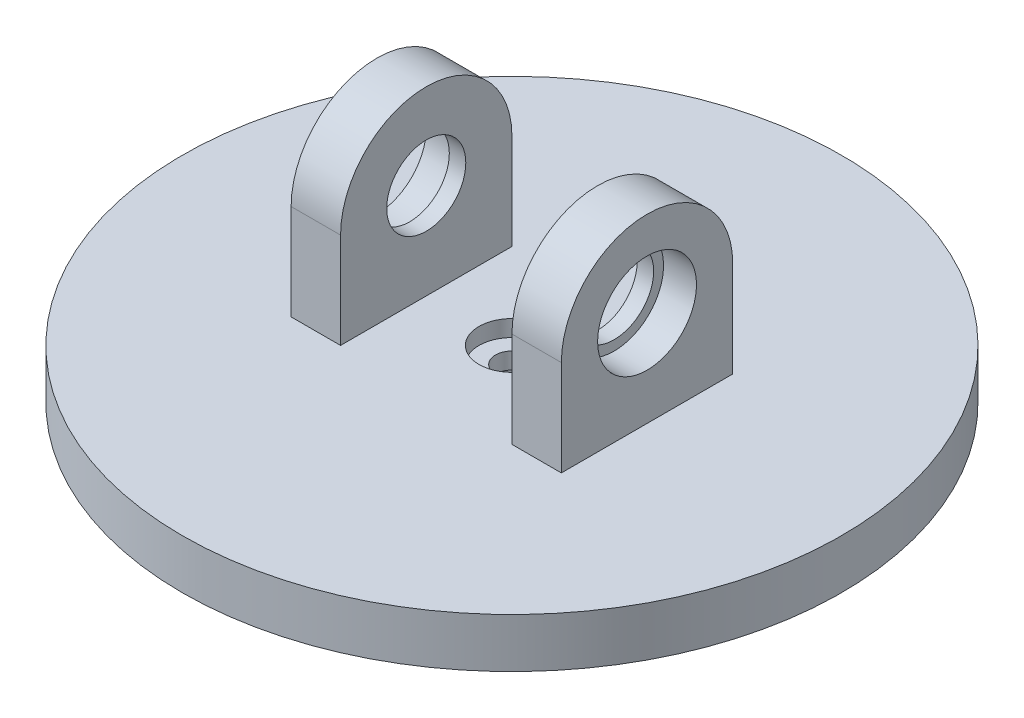
ISO-10303-21;
HEADER;
FILE_DESCRIPTION(('STEP AP214'),'2;1');
FILE_NAME('part.step','',(''),(''),'','','');
FILE_SCHEMA(('AUTOMOTIVE_DESIGN { 1 0 10303 214 1 1 1 1 }'));
ENDSEC;
DATA;
#1=APPLICATION_CONTEXT('core data for automotive mechanical design processes');
#2=APPLICATION_PROTOCOL_DEFINITION('international standard','automotive_design',2000,#1);
#3=PRODUCT_CONTEXT('',#1,'mechanical');
#4=PRODUCT('Part','Part','',(#3));
#5=PRODUCT_RELATED_PRODUCT_CATEGORY('part','',(#4));
#6=PRODUCT_DEFINITION_FORMATION('','',#4);
#7=PRODUCT_DEFINITION_CONTEXT('part definition',#1,'design');
#8=PRODUCT_DEFINITION('design','',#6,#7);
#9=PRODUCT_DEFINITION_SHAPE('','',#8);
#10=(LENGTH_UNIT() NAMED_UNIT(*) SI_UNIT(.MILLI.,.METRE.));
#11=(NAMED_UNIT(*) PLANE_ANGLE_UNIT() SI_UNIT($,.RADIAN.));
#12=(NAMED_UNIT(*) SI_UNIT($,.STERADIAN.) SOLID_ANGLE_UNIT());
#13=UNCERTAINTY_MEASURE_WITH_UNIT(LENGTH_MEASURE(1.E-05),#10,'distance_accuracy_value','');
#14=(GEOMETRIC_REPRESENTATION_CONTEXT(3) GLOBAL_UNCERTAINTY_ASSIGNED_CONTEXT((#13)) GLOBAL_UNIT_ASSIGNED_CONTEXT((#10,
#11,#12)) REPRESENTATION_CONTEXT('',''));
#15=CARTESIAN_POINT('',(0.,0.,0.));
#16=DIRECTION('',(0.,0.,1.));
#17=DIRECTION('',(1.,0.,0.));
#18=AXIS2_PLACEMENT_3D('',#15,#16,#17);
#19=CARTESIAN_POINT('',(-26.,70.,0.));
#20=DIRECTION('',(1.,0.,0.));
#21=DIRECTION('',(0.,0.,-1.));
#22=AXIS2_PLACEMENT_3D('',#19,#20,#21);
#23=PLANE('',#22);
#24=CARTESIAN_POINT('',(-26.,44.,0.));
#25=DIRECTION('',(1.,0.,0.));
#26=DIRECTION('',(0.,0.,-1.));
#27=AXIS2_PLACEMENT_3D('',#24,#25,#26);
#28=CIRCLE('',#27,12.);
#29=CARTESIAN_POINT('',(-26.,44.,-12.));
#30=VERTEX_POINT('',#29);
#31=EDGE_CURVE('E148',#30,#30,#28,.T.);
#32=ORIENTED_EDGE('',*,*,#31,.F.);
#33=EDGE_LOOP('',(#32));
#34=FACE_BOUND('',#33,.T.);
#35=CARTESIAN_POINT('',(-26.,44.,0.));
#36=DIRECTION('',(1.,0.,0.));
#37=DIRECTION('',(0.,0.,-1.));
#38=AXIS2_PLACEMENT_3D('',#35,#36,#37);
#39=CIRCLE('',#38,26.);
#40=CARTESIAN_POINT('',(-25.9999999999999,44.,-26.));
#41=VERTEX_POINT('',#40);
#42=CARTESIAN_POINT('',(-25.9999999999999,44.,26.));
#43=VERTEX_POINT('',#42);
#44=EDGE_CURVE('E202',#41,#43,#39,.T.);
#45=ORIENTED_EDGE('',*,*,#44,.T.);
#46=DIRECTION('',(0.,-1.,0.));
#47=VECTOR('',#46,1.);
#48=CARTESIAN_POINT('',(-26.,70.,26.));
#49=LINE('',#48,#47);
#50=CARTESIAN_POINT('',(-26.,15.,26.));
#51=VERTEX_POINT('',#50);
#52=EDGE_CURVE('E128',#43,#51,#49,.T.);
#53=ORIENTED_EDGE('',*,*,#52,.T.);
#54=DIRECTION('',(0.,0.,1.));
#55=VECTOR('',#54,1.);
#56=CARTESIAN_POINT('',(-26.,15.,0.));
#57=LINE('',#56,#55);
#58=CARTESIAN_POINT('',(-26.,15.,-26.));
#59=VERTEX_POINT('',#58);
#60=EDGE_CURVE('E220',#59,#51,#57,.T.);
#61=ORIENTED_EDGE('',*,*,#60,.F.);
#62=DIRECTION('',(0.,-1.,0.));
#63=VECTOR('',#62,1.);
#64=CARTESIAN_POINT('',(-26.,70.,-26.));
#65=LINE('',#64,#63);
#66=EDGE_CURVE('E137',#41,#59,#65,.T.);
#67=ORIENTED_EDGE('',*,*,#66,.F.);
#68=EDGE_LOOP('',(#45,#53,#61,#67));
#69=FACE_BOUND('',#68,.T.);
#70=ADVANCED_FACE('F41',(#34,#69),#23,.T.);
#71=CARTESIAN_POINT('',(-41.,70.,0.));
#72=DIRECTION('',(-1.,0.,0.));
#73=DIRECTION('',(0.,0.,1.));
#74=AXIS2_PLACEMENT_3D('',#71,#72,#73);
#75=PLANE('',#74);
#76=CARTESIAN_POINT('',(-41.,44.,0.));
#77=DIRECTION('',(-1.,0.,0.));
#78=DIRECTION('',(0.,0.,1.));
#79=AXIS2_PLACEMENT_3D('',#76,#77,#78);
#80=CIRCLE('',#79,15.);
#81=CARTESIAN_POINT('',(-41.,44.,15.));
#82=VERTEX_POINT('',#81);
#83=EDGE_CURVE('E188',#82,#82,#80,.T.);
#84=ORIENTED_EDGE('',*,*,#83,.F.);
#85=EDGE_LOOP('',(#84));
#86=FACE_BOUND('',#85,.T.);
#87=DIRECTION('',(0.,-1.,0.));
#88=VECTOR('',#87,1.);
#89=CARTESIAN_POINT('',(-41.,70.,26.));
#90=LINE('',#89,#88);
#91=CARTESIAN_POINT('',(-41.,44.,26.));
#92=VERTEX_POINT('',#91);
#93=CARTESIAN_POINT('',(-41.,15.,26.));
#94=VERTEX_POINT('',#93);
#95=EDGE_CURVE('E126',#92,#94,#90,.T.);
#96=ORIENTED_EDGE('',*,*,#95,.F.);
#97=CARTESIAN_POINT('',(-41.,44.,0.));
#98=DIRECTION('',(-1.,0.,0.));
#99=DIRECTION('',(0.,0.,1.));
#100=AXIS2_PLACEMENT_3D('',#97,#98,#99);
#101=CIRCLE('',#100,26.);
#102=CARTESIAN_POINT('',(-41.,44.,-26.));
#103=VERTEX_POINT('',#102);
#104=EDGE_CURVE('E111',#92,#103,#101,.T.);
#105=ORIENTED_EDGE('',*,*,#104,.T.);
#106=DIRECTION('',(0.,-1.,0.));
#107=VECTOR('',#106,1.);
#108=CARTESIAN_POINT('',(-41.,70.,-26.));
#109=LINE('',#108,#107);
#110=CARTESIAN_POINT('',(-41.,15.,-26.));
#111=VERTEX_POINT('',#110);
#112=EDGE_CURVE('E135',#103,#111,#109,.T.);
#113=ORIENTED_EDGE('',*,*,#112,.T.);
#114=DIRECTION('',(0.,0.,-1.));
#115=VECTOR('',#114,1.);
#116=CARTESIAN_POINT('',(-41.,15.,0.));
#117=LINE('',#116,#115);
#118=EDGE_CURVE('E133',#94,#111,#117,.T.);
#119=ORIENTED_EDGE('',*,*,#118,.F.);
#120=EDGE_LOOP('',(#96,#105,#113,#119));
#121=FACE_BOUND('',#120,.T.);
#122=ADVANCED_FACE('F131',(#86,#121),#75,.T.);
#123=CARTESIAN_POINT('',(26.,70.,0.));
#124=DIRECTION('',(-1.,0.,0.));
#125=DIRECTION('',(0.,0.,1.));
#126=AXIS2_PLACEMENT_3D('',#123,#124,#125);
#127=PLANE('',#126);
#128=CARTESIAN_POINT('',(26.,44.,0.));
#129=DIRECTION('',(1.,0.,0.));
#130=DIRECTION('',(0.,0.,-1.));
#131=AXIS2_PLACEMENT_3D('',#128,#129,#130);
#132=CIRCLE('',#131,12.);
#133=CARTESIAN_POINT('',(26.,44.,-12.));
#134=VERTEX_POINT('',#133);
#135=EDGE_CURVE('E303',#134,#134,#132,.T.);
#136=ORIENTED_EDGE('',*,*,#135,.T.);
#137=EDGE_LOOP('',(#136));
#138=FACE_BOUND('',#137,.T.);
#139=DIRECTION('',(0.,-1.,0.));
#140=VECTOR('',#139,1.);
#141=CARTESIAN_POINT('',(26.,70.,26.));
#142=LINE('',#141,#140);
#143=CARTESIAN_POINT('',(26.,44.,26.));
#144=VERTEX_POINT('',#143);
#145=CARTESIAN_POINT('',(26.,15.,26.));
#146=VERTEX_POINT('',#145);
#147=EDGE_CURVE('E58',#144,#146,#142,.T.);
#148=ORIENTED_EDGE('',*,*,#147,.F.);
#149=CARTESIAN_POINT('',(26.,44.,0.));
#150=DIRECTION('',(-1.,0.,0.));
#151=DIRECTION('',(0.,0.,1.));
#152=AXIS2_PLACEMENT_3D('',#149,#150,#151);
#153=CIRCLE('',#152,26.);
#154=CARTESIAN_POINT('',(26.,44.,-26.));
#155=VERTEX_POINT('',#154);
#156=EDGE_CURVE('E196',#144,#155,#153,.T.);
#157=ORIENTED_EDGE('',*,*,#156,.T.);
#158=DIRECTION('',(0.,-1.,0.));
#159=VECTOR('',#158,1.);
#160=CARTESIAN_POINT('',(26.,70.,-26.));
#161=LINE('',#160,#159);
#162=CARTESIAN_POINT('',(26.,15.,-26.));
#163=VERTEX_POINT('',#162);
#164=EDGE_CURVE('E214',#155,#163,#161,.T.);
#165=ORIENTED_EDGE('',*,*,#164,.T.);
#166=DIRECTION('',(0.,0.,-1.));
#167=VECTOR('',#166,1.);
#168=CARTESIAN_POINT('',(26.,15.,0.));
#169=LINE('',#168,#167);
#170=EDGE_CURVE('E204',#146,#163,#169,.T.);
#171=ORIENTED_EDGE('',*,*,#170,.F.);
#172=EDGE_LOOP('',(#148,#157,#165,#171));
#173=FACE_BOUND('',#172,.T.);
#174=ADVANCED_FACE('F256',(#138,#173),#127,.T.);
#175=CARTESIAN_POINT('',(41.,70.,0.));
#176=DIRECTION('',(-1.,0.,0.));
#177=DIRECTION('',(0.,0.,1.));
#178=AXIS2_PLACEMENT_3D('',#175,#176,#177);
#179=PLANE('',#178);
#180=CARTESIAN_POINT('',(41.,44.,0.));
#181=DIRECTION('',(-1.,0.,0.));
#182=DIRECTION('',(0.,0.,1.));
#183=AXIS2_PLACEMENT_3D('',#180,#181,#182);
#184=CIRCLE('',#183,15.);
#185=CARTESIAN_POINT('',(41.,44.,15.));
#186=VERTEX_POINT('',#185);
#187=EDGE_CURVE('E160',#186,#186,#184,.T.);
#188=ORIENTED_EDGE('',*,*,#187,.T.);
#189=EDGE_LOOP('',(#188));
#190=FACE_BOUND('',#189,.T.);
#191=CARTESIAN_POINT('',(41.,44.,0.));
#192=DIRECTION('',(-1.,0.,0.));
#193=DIRECTION('',(0.,0.,1.));
#194=AXIS2_PLACEMENT_3D('',#191,#192,#193);
#195=CIRCLE('',#194,26.);
#196=CARTESIAN_POINT('',(41.,44.,-26.));
#197=VERTEX_POINT('',#196);
#198=CARTESIAN_POINT('',(41.,44.,26.));
#199=VERTEX_POINT('',#198);
#200=EDGE_CURVE('E195',#197,#199,#195,.F.);
#201=ORIENTED_EDGE('',*,*,#200,.T.);
#202=DIRECTION('',(0.,-1.,0.));
#203=VECTOR('',#202,1.);
#204=CARTESIAN_POINT('',(41.,70.,26.));
#205=LINE('',#204,#203);
#206=CARTESIAN_POINT('',(41.,15.,26.));
#207=VERTEX_POINT('',#206);
#208=EDGE_CURVE('E66',#199,#207,#205,.T.);
#209=ORIENTED_EDGE('',*,*,#208,.T.);
#210=DIRECTION('',(0.,0.,-1.));
#211=VECTOR('',#210,1.);
#212=CARTESIAN_POINT('',(41.,15.,0.));
#213=LINE('',#212,#211);
#214=CARTESIAN_POINT('',(41.,15.,-26.));
#215=VERTEX_POINT('',#214);
#216=EDGE_CURVE('E209',#207,#215,#213,.T.);
#217=ORIENTED_EDGE('',*,*,#216,.T.);
#218=DIRECTION('',(0.,-1.,0.));
#219=VECTOR('',#218,1.);
#220=CARTESIAN_POINT('',(41.,70.,-26.));
#221=LINE('',#220,#219);
#222=EDGE_CURVE('E216',#197,#215,#221,.T.);
#223=ORIENTED_EDGE('',*,*,#222,.F.);
#224=EDGE_LOOP('',(#201,#209,#217,#223));
#225=FACE_BOUND('',#224,.T.);
#226=ADVANCED_FACE('F265',(#190,#225),#179,.F.);
#227=CARTESIAN_POINT('',(0.,15.,0.));
#228=DIRECTION('',(0.,-1.,0.));
#229=DIRECTION('',(0.,0.,-1.));
#230=AXIS2_PLACEMENT_3D('',#227,#228,#229);
#231=CYLINDRICAL_SURFACE('',#230,100.);
#232=CARTESIAN_POINT('',(0.,15.,0.));
#233=DIRECTION('',(0.,1.,0.));
#234=DIRECTION('',(0.,0.,1.));
#235=AXIS2_PLACEMENT_3D('',#232,#233,#234);
#236=CIRCLE('',#235,100.);
#237=CARTESIAN_POINT('',(0.,15.,100.));
#238=VERTEX_POINT('',#237);
#239=EDGE_CURVE('E11',#238,#238,#236,.T.);
#240=ORIENTED_EDGE('',*,*,#239,.F.);
#241=EDGE_LOOP('',(#240));
#242=FACE_BOUND('',#241,.T.);
#243=CARTESIAN_POINT('',(0.,0.,0.));
#244=DIRECTION('',(0.,1.,0.));
#245=DIRECTION('',(0.,0.,1.));
#246=AXIS2_PLACEMENT_3D('',#243,#244,#245);
#247=CIRCLE('',#246,100.);
#248=CARTESIAN_POINT('',(0.,0.,100.));
#249=VERTEX_POINT('',#248);
#250=EDGE_CURVE('E50',#249,#249,#247,.T.);
#251=ORIENTED_EDGE('',*,*,#250,.T.);
#252=EDGE_LOOP('',(#251));
#253=FACE_BOUND('',#252,.T.);
#254=ADVANCED_FACE('F43',(#242,#253),#231,.T.);
#255=CARTESIAN_POINT('',(0.,15.,0.));
#256=DIRECTION('',(0.,1.,0.));
#257=DIRECTION('',(0.,0.,1.));
#258=AXIS2_PLACEMENT_3D('',#255,#256,#257);
#259=PLANE('',#258);
#260=CARTESIAN_POINT('',(0.,15.,0.));
#261=DIRECTION('',(0.,1.,0.));
#262=DIRECTION('',(0.,0.,1.));
#263=AXIS2_PLACEMENT_3D('',#260,#261,#262);
#264=CIRCLE('',#263,10.);
#265=CARTESIAN_POINT('',(0.,15.,10.));
#266=VERTEX_POINT('',#265);
#267=EDGE_CURVE('E182',#266,#266,#264,.T.);
#268=ORIENTED_EDGE('',*,*,#267,.F.);
#269=EDGE_LOOP('',(#268));
#270=FACE_BOUND('',#269,.T.);
#271=ORIENTED_EDGE('',*,*,#170,.T.);
#272=DIRECTION('',(1.,0.,0.));
#273=VECTOR('',#272,1.);
#274=CARTESIAN_POINT('',(0.,15.,-26.));
#275=LINE('',#274,#273);
#276=EDGE_CURVE('E211',#163,#215,#275,.T.);
#277=ORIENTED_EDGE('',*,*,#276,.T.);
#278=ORIENTED_EDGE('',*,*,#216,.F.);
#279=DIRECTION('',(1.,0.,0.));
#280=VECTOR('',#279,1.);
#281=CARTESIAN_POINT('',(0.,15.,26.));
#282=LINE('',#281,#280);
#283=EDGE_CURVE('E207',#146,#207,#282,.T.);
#284=ORIENTED_EDGE('',*,*,#283,.F.);
#285=EDGE_LOOP('',(#271,#277,#278,#284));
#286=FACE_BOUND('',#285,.T.);
#287=ORIENTED_EDGE('',*,*,#60,.T.);
#288=DIRECTION('',(1.,0.,0.));
#289=VECTOR('',#288,1.);
#290=CARTESIAN_POINT('',(0.,15.,26.));
#291=LINE('',#290,#289);
#292=EDGE_CURVE('E139',#94,#51,#291,.T.);
#293=ORIENTED_EDGE('',*,*,#292,.F.);
#294=ORIENTED_EDGE('',*,*,#118,.T.);
#295=DIRECTION('',(1.,0.,0.));
#296=VECTOR('',#295,1.);
#297=CARTESIAN_POINT('',(0.,15.,-26.));
#298=LINE('',#297,#296);
#299=EDGE_CURVE('E223',#111,#59,#298,.T.);
#300=ORIENTED_EDGE('',*,*,#299,.T.);
#301=EDGE_LOOP('',(#287,#293,#294,#300));
#302=FACE_BOUND('',#301,.T.);
#303=ORIENTED_EDGE('',*,*,#239,.T.);
#304=EDGE_LOOP('',(#303));
#305=FACE_BOUND('',#304,.T.);
#306=ADVANCED_FACE('F228',(#270,#286,#302,#305),#259,.T.);
#307=CARTESIAN_POINT('',(0.,0.,0.));
#308=DIRECTION('',(0.,1.,0.));
#309=DIRECTION('',(0.,0.,1.));
#310=AXIS2_PLACEMENT_3D('',#307,#308,#309);
#311=PLANE('',#310);
#312=CARTESIAN_POINT('',(0.,0.,0.));
#313=DIRECTION('',(0.,-1.,0.));
#314=DIRECTION('',(0.,0.,-1.));
#315=AXIS2_PLACEMENT_3D('',#312,#313,#314);
#316=CIRCLE('',#315,90.);
#317=CARTESIAN_POINT('',(0.,0.,-90.));
#318=VERTEX_POINT('',#317);
#319=EDGE_CURVE('E170',#318,#318,#316,.T.);
#320=ORIENTED_EDGE('',*,*,#319,.F.);
#321=EDGE_LOOP('',(#320));
#322=FACE_BOUND('',#321,.T.);
#323=ORIENTED_EDGE('',*,*,#250,.F.);
#324=EDGE_LOOP('',(#323));
#325=FACE_BOUND('',#324,.T.);
#326=ADVANCED_FACE('F236',(#322,#325),#311,.F.);
#327=CARTESIAN_POINT('',(0.,70.,-26.));
#328=DIRECTION('',(0.,0.,-1.));
#329=DIRECTION('',(-1.,0.,0.));
#330=AXIS2_PLACEMENT_3D('',#327,#328,#329);
#331=PLANE('',#330);
#332=DIRECTION('',(-1.,0.,0.));
#333=VECTOR('',#332,1.);
#334=CARTESIAN_POINT('',(77.7695526217005,44.,-26.));
#335=LINE('',#334,#333);
#336=EDGE_CURVE('E117',#41,#103,#335,.T.);
#337=ORIENTED_EDGE('',*,*,#336,.F.);
#338=ORIENTED_EDGE('',*,*,#66,.T.);
#339=ORIENTED_EDGE('',*,*,#299,.F.);
#340=ORIENTED_EDGE('',*,*,#112,.F.);
#341=EDGE_LOOP('',(#337,#338,#339,#340));
#342=FACE_BOUND('',#341,.T.);
#343=ADVANCED_FACE('F234',(#342),#331,.T.);
#344=CARTESIAN_POINT('',(0.,70.,26.));
#345=DIRECTION('',(0.,0.,-1.));
#346=DIRECTION('',(-1.,0.,0.));
#347=AXIS2_PLACEMENT_3D('',#344,#345,#346);
#348=PLANE('',#347);
#349=ORIENTED_EDGE('',*,*,#52,.F.);
#350=DIRECTION('',(-1.,0.,0.));
#351=VECTOR('',#350,1.);
#352=CARTESIAN_POINT('',(77.7695526217005,44.,26.));
#353=LINE('',#352,#351);
#354=EDGE_CURVE('E114',#43,#92,#353,.T.);
#355=ORIENTED_EDGE('',*,*,#354,.T.);
#356=ORIENTED_EDGE('',*,*,#95,.T.);
#357=ORIENTED_EDGE('',*,*,#292,.T.);
#358=EDGE_LOOP('',(#349,#355,#356,#357));
#359=FACE_BOUND('',#358,.T.);
#360=ADVANCED_FACE('F124',(#359),#348,.F.);
#361=CARTESIAN_POINT('',(0.,70.,26.));
#362=DIRECTION('',(0.,0.,-1.));
#363=DIRECTION('',(-1.,0.,0.));
#364=AXIS2_PLACEMENT_3D('',#361,#362,#363);
#365=PLANE('',#364);
#366=ORIENTED_EDGE('',*,*,#208,.F.);
#367=EDGE_CURVE('E121',#199,#144,#353,.T.);
#368=ORIENTED_EDGE('',*,*,#367,.T.);
#369=ORIENTED_EDGE('',*,*,#147,.T.);
#370=ORIENTED_EDGE('',*,*,#283,.T.);
#371=EDGE_LOOP('',(#366,#368,#369,#370));
#372=FACE_BOUND('',#371,.T.);
#373=ADVANCED_FACE('F242',(#372),#365,.F.);
#374=CARTESIAN_POINT('',(0.,70.,-26.));
#375=DIRECTION('',(0.,0.,-1.));
#376=DIRECTION('',(-1.,0.,0.));
#377=AXIS2_PLACEMENT_3D('',#374,#375,#376);
#378=PLANE('',#377);
#379=EDGE_CURVE('E197',#197,#155,#335,.T.);
#380=ORIENTED_EDGE('',*,*,#379,.F.);
#381=ORIENTED_EDGE('',*,*,#222,.T.);
#382=ORIENTED_EDGE('',*,*,#276,.F.);
#383=ORIENTED_EDGE('',*,*,#164,.F.);
#384=EDGE_LOOP('',(#380,#381,#382,#383));
#385=FACE_BOUND('',#384,.T.);
#386=ADVANCED_FACE('F275',(#385),#378,.T.);
#387=CARTESIAN_POINT('',(77.7695526217005,44.,0.));
#388=DIRECTION('',(-1.,0.,0.));
#389=DIRECTION('',(0.,0.,1.));
#390=AXIS2_PLACEMENT_3D('',#387,#388,#389);
#391=CYLINDRICAL_SURFACE('',#390,26.);
#392=ORIENTED_EDGE('',*,*,#156,.F.);
#393=ORIENTED_EDGE('',*,*,#367,.F.);
#394=ORIENTED_EDGE('',*,*,#200,.F.);
#395=ORIENTED_EDGE('',*,*,#379,.T.);
#396=EDGE_LOOP('',(#392,#393,#394,#395));
#397=FACE_BOUND('',#396,.T.);
#398=ADVANCED_FACE('F279',(#397),#391,.T.);
#399=ORIENTED_EDGE('',*,*,#336,.T.);
#400=ORIENTED_EDGE('',*,*,#104,.F.);
#401=ORIENTED_EDGE('',*,*,#354,.F.);
#402=ORIENTED_EDGE('',*,*,#44,.F.);
#403=EDGE_LOOP('',(#399,#400,#401,#402));
#404=FACE_BOUND('',#403,.T.);
#405=ADVANCED_FACE('F113',(#404),#391,.T.);
#406=CARTESIAN_POINT('',(-31.,44.,0.));
#407=DIRECTION('',(-1.,0.,0.));
#408=DIRECTION('',(0.,0.,1.));
#409=AXIS2_PLACEMENT_3D('',#406,#407,#408);
#410=CYLINDRICAL_SURFACE('',#409,15.);
#411=CARTESIAN_POINT('',(-31.,44.,0.));
#412=DIRECTION('',(-1.,0.,0.));
#413=DIRECTION('',(0.,0.,1.));
#414=AXIS2_PLACEMENT_3D('',#411,#412,#413);
#415=CIRCLE('',#414,15.);
#416=CARTESIAN_POINT('',(-31.,44.,15.));
#417=VERTEX_POINT('',#416);
#418=EDGE_CURVE('E129',#417,#417,#415,.T.);
#419=ORIENTED_EDGE('',*,*,#418,.F.);
#420=EDGE_LOOP('',(#419));
#421=FACE_BOUND('',#420,.T.);
#422=ORIENTED_EDGE('',*,*,#83,.T.);
#423=EDGE_LOOP('',(#422));
#424=FACE_BOUND('',#423,.T.);
#425=ADVANCED_FACE('F286',(#421,#424),#410,.F.);
#426=CARTESIAN_POINT('',(-31.,44.,0.));
#427=DIRECTION('',(-1.,0.,0.));
#428=DIRECTION('',(0.,0.,1.));
#429=AXIS2_PLACEMENT_3D('',#426,#427,#428);
#430=PLANE('',#429);
#431=CARTESIAN_POINT('',(-31.,44.,0.));
#432=DIRECTION('',(-1.,0.,0.));
#433=DIRECTION('',(0.,0.,1.));
#434=AXIS2_PLACEMENT_3D('',#431,#432,#433);
#435=CIRCLE('',#434,12.);
#436=CARTESIAN_POINT('',(-31.,44.,12.));
#437=VERTEX_POINT('',#436);
#438=EDGE_CURVE('E145',#437,#437,#435,.T.);
#439=ORIENTED_EDGE('',*,*,#438,.F.);
#440=EDGE_LOOP('',(#439));
#441=FACE_BOUND('',#440,.T.);
#442=ORIENTED_EDGE('',*,*,#418,.T.);
#443=EDGE_LOOP('',(#442));
#444=FACE_BOUND('',#443,.T.);
#445=ADVANCED_FACE('F354',(#441,#444),#430,.T.);
#446=CARTESIAN_POINT('',(0.,10.,0.));
#447=DIRECTION('',(0.,1.,0.));
#448=DIRECTION('',(0.,0.,1.));
#449=AXIS2_PLACEMENT_3D('',#446,#447,#448);
#450=CYLINDRICAL_SURFACE('',#449,10.);
#451=CARTESIAN_POINT('',(0.,10.,0.));
#452=DIRECTION('',(0.,1.,0.));
#453=DIRECTION('',(0.,0.,1.));
#454=AXIS2_PLACEMENT_3D('',#451,#452,#453);
#455=CIRCLE('',#454,10.);
#456=CARTESIAN_POINT('',(0.,10.,10.));
#457=VERTEX_POINT('',#456);
#458=EDGE_CURVE('E185',#457,#457,#455,.T.);
#459=ORIENTED_EDGE('',*,*,#458,.F.);
#460=EDGE_LOOP('',(#459));
#461=FACE_BOUND('',#460,.T.);
#462=ORIENTED_EDGE('',*,*,#267,.T.);
#463=EDGE_LOOP('',(#462));
#464=FACE_BOUND('',#463,.T.);
#465=ADVANCED_FACE('F352',(#461,#464),#450,.F.);
#466=CARTESIAN_POINT('',(0.,10.,0.));
#467=DIRECTION('',(0.,1.,0.));
#468=DIRECTION('',(0.,0.,1.));
#469=AXIS2_PLACEMENT_3D('',#466,#467,#468);
#470=PLANE('',#469);
#471=CARTESIAN_POINT('',(0.,10.,0.));
#472=DIRECTION('',(0.,-1.,0.));
#473=DIRECTION('',(0.,0.,-1.));
#474=AXIS2_PLACEMENT_3D('',#471,#472,#473);
#475=CIRCLE('',#474,5.);
#476=CARTESIAN_POINT('',(0.,10.,-5.));
#477=VERTEX_POINT('',#476);
#478=EDGE_CURVE('E152',#477,#477,#475,.T.);
#479=ORIENTED_EDGE('',*,*,#478,.T.);
#480=EDGE_LOOP('',(#479));
#481=FACE_BOUND('',#480,.T.);
#482=ORIENTED_EDGE('',*,*,#458,.T.);
#483=EDGE_LOOP('',(#482));
#484=FACE_BOUND('',#483,.T.);
#485=ADVANCED_FACE('F341',(#481,#484),#470,.T.);
#486=CARTESIAN_POINT('',(0.,2.8,0.));
#487=DIRECTION('',(0.,-1.,0.));
#488=DIRECTION('',(0.,0.,-1.));
#489=AXIS2_PLACEMENT_3D('',#486,#487,#488);
#490=CYLINDRICAL_SURFACE('',#489,90.);
#491=CARTESIAN_POINT('',(0.,2.8,0.));
#492=DIRECTION('',(0.,-1.,0.));
#493=DIRECTION('',(0.,0.,-1.));
#494=AXIS2_PLACEMENT_3D('',#491,#492,#493);
#495=CIRCLE('',#494,90.);
#496=CARTESIAN_POINT('',(0.,2.8,-90.));
#497=VERTEX_POINT('',#496);
#498=EDGE_CURVE('E173',#497,#497,#495,.T.);
#499=ORIENTED_EDGE('',*,*,#498,.F.);
#500=EDGE_LOOP('',(#499));
#501=FACE_BOUND('',#500,.T.);
#502=ORIENTED_EDGE('',*,*,#319,.T.);
#503=EDGE_LOOP('',(#502));
#504=FACE_BOUND('',#503,.T.);
#505=ADVANCED_FACE('F337',(#501,#504),#490,.F.);
#506=CARTESIAN_POINT('',(0.,2.8,0.));
#507=DIRECTION('',(0.,-1.,0.));
#508=DIRECTION('',(0.,0.,-1.));
#509=AXIS2_PLACEMENT_3D('',#506,#507,#508);
#510=PLANE('',#509);
#511=CARTESIAN_POINT('',(0.,2.8,0.));
#512=DIRECTION('',(0.,-1.,0.));
#513=DIRECTION('',(0.,0.,-1.));
#514=AXIS2_PLACEMENT_3D('',#511,#512,#513);
#515=CIRCLE('',#514,84.);
#516=CARTESIAN_POINT('',(0.,2.8,-84.));
#517=VERTEX_POINT('',#516);
#518=EDGE_CURVE('E167',#517,#517,#515,.T.);
#519=ORIENTED_EDGE('',*,*,#518,.F.);
#520=EDGE_LOOP('',(#519));
#521=FACE_BOUND('',#520,.T.);
#522=ORIENTED_EDGE('',*,*,#498,.T.);
#523=EDGE_LOOP('',(#522));
#524=FACE_BOUND('',#523,.T.);
#525=ADVANCED_FACE('F333',(#521,#524),#510,.T.);
#526=CARTESIAN_POINT('',(0.,2.8,0.));
#527=DIRECTION('',(0.,-1.,0.));
#528=DIRECTION('',(0.,0.,-1.));
#529=AXIS2_PLACEMENT_3D('',#526,#527,#528);
#530=CYLINDRICAL_SURFACE('',#529,84.);
#531=ORIENTED_EDGE('',*,*,#518,.T.);
#532=EDGE_LOOP('',(#531));
#533=FACE_BOUND('',#532,.T.);
#534=CARTESIAN_POINT('',(0.,0.,0.));
#535=DIRECTION('',(0.,-1.,0.));
#536=DIRECTION('',(0.,0.,-1.));
#537=AXIS2_PLACEMENT_3D('',#534,#535,#536);
#538=CIRCLE('',#537,84.);
#539=CARTESIAN_POINT('',(0.,0.,-84.));
#540=VERTEX_POINT('',#539);
#541=EDGE_CURVE('E165',#540,#540,#538,.T.);
#542=ORIENTED_EDGE('',*,*,#541,.F.);
#543=EDGE_LOOP('',(#542));
#544=FACE_BOUND('',#543,.T.);
#545=ADVANCED_FACE('F329',(#533,#544),#530,.T.);
#546=CARTESIAN_POINT('',(0.,5.,0.));
#547=DIRECTION('',(0.,-1.,0.));
#548=DIRECTION('',(0.,0.,-1.));
#549=AXIS2_PLACEMENT_3D('',#546,#547,#548);
#550=PLANE('',#549);
#551=CARTESIAN_POINT('',(0.,5.,0.));
#552=DIRECTION('',(0.,-1.,0.));
#553=DIRECTION('',(0.,0.,-1.));
#554=AXIS2_PLACEMENT_3D('',#551,#552,#553);
#555=CIRCLE('',#554,5.);
#556=CARTESIAN_POINT('',(0.,5.,-5.));
#557=VERTEX_POINT('',#556);
#558=EDGE_CURVE('E147',#557,#557,#555,.T.);
#559=ORIENTED_EDGE('',*,*,#558,.F.);
#560=EDGE_LOOP('',(#559));
#561=FACE_BOUND('',#560,.T.);
#562=CARTESIAN_POINT('',(0.,5.,0.));
#563=DIRECTION('',(0.,-1.,0.));
#564=DIRECTION('',(0.,0.,-1.));
#565=AXIS2_PLACEMENT_3D('',#562,#563,#564);
#566=CIRCLE('',#565,10.);
#567=CARTESIAN_POINT('',(0.,5.,-10.));
#568=VERTEX_POINT('',#567);
#569=EDGE_CURVE('E179',#568,#568,#566,.T.);
#570=ORIENTED_EDGE('',*,*,#569,.T.);
#571=EDGE_LOOP('',(#570));
#572=FACE_BOUND('',#571,.T.);
#573=ADVANCED_FACE('F332',(#561,#572),#550,.T.);
#574=CARTESIAN_POINT('',(0.,5.,0.));
#575=DIRECTION('',(0.,-1.,0.));
#576=DIRECTION('',(0.,0.,-1.));
#577=AXIS2_PLACEMENT_3D('',#574,#575,#576);
#578=CYLINDRICAL_SURFACE('',#577,10.);
#579=ORIENTED_EDGE('',*,*,#569,.F.);
#580=EDGE_LOOP('',(#579));
#581=FACE_BOUND('',#580,.T.);
#582=CARTESIAN_POINT('',(0.,0.,0.));
#583=DIRECTION('',(0.,-1.,0.));
#584=DIRECTION('',(0.,0.,-1.));
#585=AXIS2_PLACEMENT_3D('',#582,#583,#584);
#586=CIRCLE('',#585,10.);
#587=CARTESIAN_POINT('',(0.,0.,-10.));
#588=VERTEX_POINT('',#587);
#589=EDGE_CURVE('E176',#588,#588,#586,.T.);
#590=ORIENTED_EDGE('',*,*,#589,.T.);
#591=EDGE_LOOP('',(#590));
#592=FACE_BOUND('',#591,.T.);
#593=ADVANCED_FACE('F345',(#581,#592),#578,.F.);
#594=ORIENTED_EDGE('',*,*,#589,.F.);
#595=EDGE_LOOP('',(#594));
#596=FACE_BOUND('',#595,.T.);
#597=ORIENTED_EDGE('',*,*,#541,.T.);
#598=EDGE_LOOP('',(#597));
#599=FACE_BOUND('',#598,.T.);
#600=ADVANCED_FACE('F246',(#596,#599),#311,.F.);
#601=CARTESIAN_POINT('',(0.,10.,0.));
#602=DIRECTION('',(0.,-1.,0.));
#603=DIRECTION('',(0.,0.,-1.));
#604=AXIS2_PLACEMENT_3D('',#601,#602,#603);
#605=CYLINDRICAL_SURFACE('',#604,5.);
#606=ORIENTED_EDGE('',*,*,#478,.F.);
#607=EDGE_LOOP('',(#606));
#608=FACE_BOUND('',#607,.T.);
#609=ORIENTED_EDGE('',*,*,#558,.T.);
#610=EDGE_LOOP('',(#609));
#611=FACE_BOUND('',#610,.T.);
#612=ADVANCED_FACE('F323',(#608,#611),#605,.F.);
#613=CARTESIAN_POINT('',(-36.,44.,0.));
#614=DIRECTION('',(1.,0.,0.));
#615=DIRECTION('',(0.,0.,-1.));
#616=AXIS2_PLACEMENT_3D('',#613,#614,#615);
#617=CYLINDRICAL_SURFACE('',#616,12.);
#618=ORIENTED_EDGE('',*,*,#438,.T.);
#619=EDGE_LOOP('',(#618));
#620=FACE_BOUND('',#619,.T.);
#621=ORIENTED_EDGE('',*,*,#31,.T.);
#622=EDGE_LOOP('',(#621));
#623=FACE_BOUND('',#622,.T.);
#624=ADVANCED_FACE('F315',(#620,#623),#617,.F.);
#625=CARTESIAN_POINT('',(31.,44.,0.));
#626=DIRECTION('',(1.,0.,0.));
#627=DIRECTION('',(0.,0.,-1.));
#628=AXIS2_PLACEMENT_3D('',#625,#626,#627);
#629=CYLINDRICAL_SURFACE('',#628,15.);
#630=CARTESIAN_POINT('',(31.,44.,0.));
#631=DIRECTION('',(-1.,0.,0.));
#632=DIRECTION('',(0.,0.,1.));
#633=AXIS2_PLACEMENT_3D('',#630,#631,#632);
#634=CIRCLE('',#633,15.);
#635=CARTESIAN_POINT('',(31.,44.,15.));
#636=VERTEX_POINT('',#635);
#637=EDGE_CURVE('E155',#636,#636,#634,.T.);
#638=ORIENTED_EDGE('',*,*,#637,.T.);
#639=EDGE_LOOP('',(#638));
#640=FACE_BOUND('',#639,.T.);
#641=ORIENTED_EDGE('',*,*,#187,.F.);
#642=EDGE_LOOP('',(#641));
#643=FACE_BOUND('',#642,.T.);
#644=ADVANCED_FACE('F312',(#640,#643),#629,.F.);
#645=CARTESIAN_POINT('',(31.,44.,0.));
#646=DIRECTION('',(1.,0.,0.));
#647=DIRECTION('',(0.,0.,1.));
#648=AXIS2_PLACEMENT_3D('',#645,#646,#647);
#649=PLANE('',#648);
#650=CARTESIAN_POINT('',(31.,44.,0.));
#651=DIRECTION('',(1.,0.,0.));
#652=DIRECTION('',(0.,0.,-1.));
#653=AXIS2_PLACEMENT_3D('',#650,#651,#652);
#654=CIRCLE('',#653,12.);
#655=CARTESIAN_POINT('',(31.,44.,-12.));
#656=VERTEX_POINT('',#655);
#657=EDGE_CURVE('E45',#656,#656,#654,.F.);
#658=ORIENTED_EDGE('',*,*,#657,.T.);
#659=EDGE_LOOP('',(#658));
#660=FACE_BOUND('',#659,.T.);
#661=ORIENTED_EDGE('',*,*,#637,.F.);
#662=EDGE_LOOP('',(#661));
#663=FACE_BOUND('',#662,.T.);
#664=ADVANCED_FACE('F314',(#660,#663),#649,.T.);
#665=CARTESIAN_POINT('',(36.,44.,0.));
#666=DIRECTION('',(-1.,0.,0.));
#667=DIRECTION('',(0.,0.,1.));
#668=AXIS2_PLACEMENT_3D('',#665,#666,#667);
#669=CYLINDRICAL_SURFACE('',#668,12.);
#670=ORIENTED_EDGE('',*,*,#657,.F.);
#671=EDGE_LOOP('',(#670));
#672=FACE_BOUND('',#671,.T.);
#673=ORIENTED_EDGE('',*,*,#135,.F.);
#674=EDGE_LOOP('',(#673));
#675=FACE_BOUND('',#674,.T.);
#676=ADVANCED_FACE('F321',(#672,#675),#669,.F.);
#677=CLOSED_SHELL('',(#70,#122,#174,#226,#254,#306,#326,#343,#360,#373,#386,#398,#405,#425,#445,
#465,#485,#505,#525,#545,#573,#593,#600,#612,#624,#644,#664,#676));
#678=MANIFOLD_SOLID_BREP('B2',#677);
#679=ADVANCED_BREP_SHAPE_REPRESENTATION('',(#18,#678),#14);
#680=SHAPE_DEFINITION_REPRESENTATION(#9,#679);
ENDSEC;
END-ISO-10303-21;
